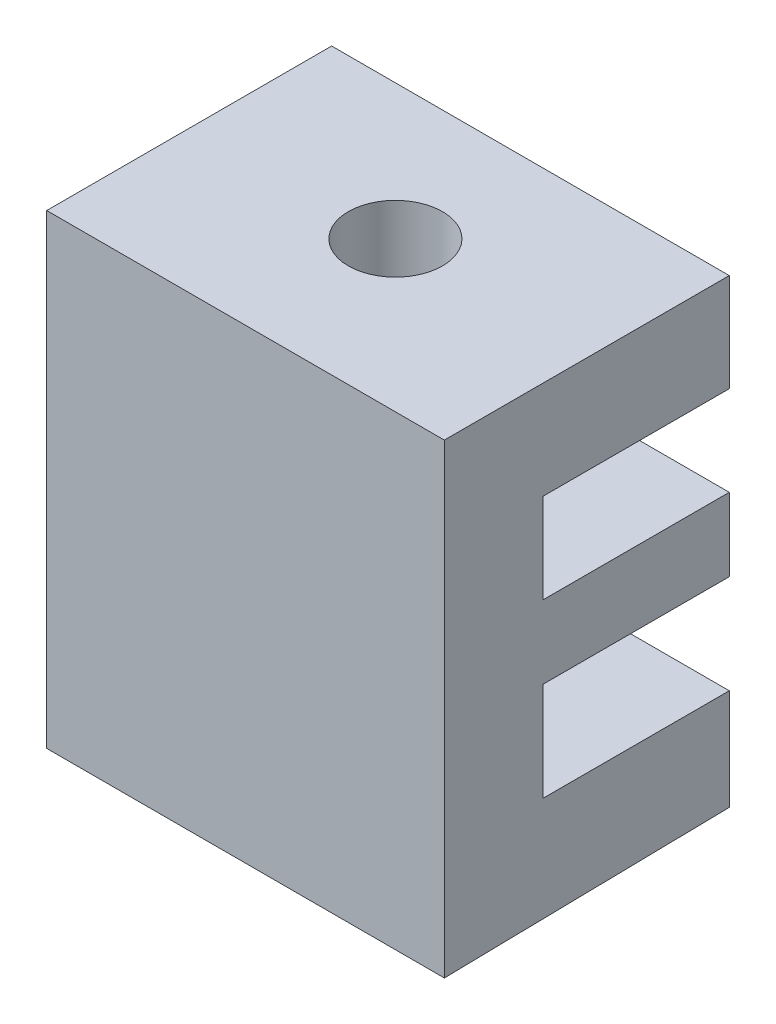
ISO-10303-21;
HEADER;
FILE_DESCRIPTION(('STEP AP214'),'2;1');
FILE_NAME('part.step','',(''),(''),'','','');
FILE_SCHEMA(('AUTOMOTIVE_DESIGN { 1 0 10303 214 1 1 1 1 }'));
ENDSEC;
DATA;
#1=APPLICATION_CONTEXT('core data for automotive mechanical design processes');
#2=APPLICATION_PROTOCOL_DEFINITION('international standard','automotive_design',2000,#1);
#3=PRODUCT_CONTEXT('',#1,'mechanical');
#4=PRODUCT('Part','Part','',(#3));
#5=PRODUCT_RELATED_PRODUCT_CATEGORY('part','',(#4));
#6=PRODUCT_DEFINITION_FORMATION('','',#4);
#7=PRODUCT_DEFINITION_CONTEXT('part definition',#1,'design');
#8=PRODUCT_DEFINITION('design','',#6,#7);
#9=PRODUCT_DEFINITION_SHAPE('','',#8);
#10=(LENGTH_UNIT() NAMED_UNIT(*) SI_UNIT(.MILLI.,.METRE.));
#11=(NAMED_UNIT(*) PLANE_ANGLE_UNIT() SI_UNIT($,.RADIAN.));
#12=(NAMED_UNIT(*) SI_UNIT($,.STERADIAN.) SOLID_ANGLE_UNIT());
#13=UNCERTAINTY_MEASURE_WITH_UNIT(LENGTH_MEASURE(1.E-05),#10,'distance_accuracy_value','');
#14=(GEOMETRIC_REPRESENTATION_CONTEXT(3) GLOBAL_UNCERTAINTY_ASSIGNED_CONTEXT((#13)) GLOBAL_UNIT_ASSIGNED_CONTEXT((#10,
#11,#12)) REPRESENTATION_CONTEXT('',''));
#15=CARTESIAN_POINT('',(0.,0.,0.));
#16=DIRECTION('',(0.,0.,1.));
#17=DIRECTION('',(1.,0.,0.));
#18=AXIS2_PLACEMENT_3D('',#15,#16,#17);
#19=CARTESIAN_POINT('',(50.,53.7467128027682,0.));
#20=DIRECTION('',(0.,0.,-1.));
#21=DIRECTION('',(-1.,0.,0.));
#22=AXIS2_PLACEMENT_3D('',#19,#20,#21);
#23=PLANE('',#22);
#24=DIRECTION('',(0.,-1.,0.));
#25=VECTOR('',#24,1.);
#26=CARTESIAN_POINT('',(-50.,53.7467128027682,0.));
#27=LINE('',#26,#25);
#28=CARTESIAN_POINT('',(-50.,67.7758371322385,0.));
#29=VERTEX_POINT('',#28);
#30=CARTESIAN_POINT('',(-50.,-49.3863092949598,0.));
#31=VERTEX_POINT('',#30);
#32=EDGE_CURVE('E100',#29,#31,#27,.T.);
#33=ORIENTED_EDGE('',*,*,#32,.T.);
#34=DIRECTION('',(-1.,0.,0.));
#35=VECTOR('',#34,1.);
#36=CARTESIAN_POINT('',(50.,-49.3863092949598,0.));
#37=LINE('',#36,#35);
#38=CARTESIAN_POINT('',(50.,-49.3863092949598,0.));
#39=VERTEX_POINT('',#38);
#40=EDGE_CURVE('E13',#39,#31,#37,.T.);
#41=ORIENTED_EDGE('',*,*,#40,.F.);
#42=DIRECTION('',(0.,-1.,0.));
#43=VECTOR('',#42,1.);
#44=CARTESIAN_POINT('',(50.,67.7758371322385,0.));
#45=LINE('',#44,#43);
#46=CARTESIAN_POINT('',(50.,67.7758371322385,0.));
#47=VERTEX_POINT('',#46);
#48=EDGE_CURVE('E106',#47,#39,#45,.T.);
#49=ORIENTED_EDGE('',*,*,#48,.F.);
#50=DIRECTION('',(-1.,0.,0.));
#51=VECTOR('',#50,1.);
#52=CARTESIAN_POINT('',(50.,67.7758371322385,0.));
#53=LINE('',#52,#51);
#54=EDGE_CURVE('E152',#47,#29,#53,.T.);
#55=ORIENTED_EDGE('',*,*,#54,.T.);
#56=EDGE_LOOP('',(#33,#41,#49,#55));
#57=FACE_BOUND('',#56,.T.);
#58=ADVANCED_FACE('F36',(#57),#23,.F.);
#59=CARTESIAN_POINT('',(50.,-49.3863092949598,0.));
#60=DIRECTION('',(0.,0.999828576325131,0.0185153440060208));
#61=DIRECTION('',(0.,-0.0185153440060208,0.999828576325131));
#62=AXIS2_PLACEMENT_3D('',#59,#60,#61);
#63=PLANE('',#62);
#64=DIRECTION('',(0.,0.0185153440060208,-0.999828576325131));
#65=VECTOR('',#64,1.);
#66=CARTESIAN_POINT('',(-50.,-49.3863092949598,0.));
#67=LINE('',#66,#65);
#68=CARTESIAN_POINT('',(-50.,-48.0592299664964,-71.6622837370242));
#69=VERTEX_POINT('',#68);
#70=EDGE_CURVE('E157',#31,#69,#67,.T.);
#71=ORIENTED_EDGE('',*,*,#70,.T.);
#72=DIRECTION('',(-1.,0.,0.));
#73=VECTOR('',#72,1.);
#74=CARTESIAN_POINT('',(50.,-48.0592299664964,-71.6622837370242));
#75=LINE('',#74,#73);
#76=CARTESIAN_POINT('',(50.,-48.0592299664964,-71.6622837370242));
#77=VERTEX_POINT('',#76);
#78=EDGE_CURVE('E44',#77,#69,#75,.T.);
#79=ORIENTED_EDGE('',*,*,#78,.F.);
#80=DIRECTION('',(0.,0.0185153440060208,-0.999828576325131));
#81=VECTOR('',#80,1.);
#82=CARTESIAN_POINT('',(50.,-49.3863092949598,0.));
#83=LINE('',#82,#81);
#84=EDGE_CURVE('E246',#39,#77,#83,.T.);
#85=ORIENTED_EDGE('',*,*,#84,.F.);
#86=ORIENTED_EDGE('',*,*,#40,.T.);
#87=EDGE_LOOP('',(#71,#79,#85,#86));
#88=FACE_BOUND('',#87,.T.);
#89=ADVANCED_FACE('F251',(#88),#63,.F.);
#90=CARTESIAN_POINT('',(50.,-48.0592299664964,-71.6622837370242));
#91=DIRECTION('',(0.,0.,1.));
#92=DIRECTION('',(1.,0.,0.));
#93=AXIS2_PLACEMENT_3D('',#90,#91,#92);
#94=PLANE('',#93);
#95=DIRECTION('',(0.,1.,0.));
#96=VECTOR('',#95,1.);
#97=CARTESIAN_POINT('',(-50.,-48.0592299664964,-71.6622837370242));
#98=LINE('',#97,#96);
#99=CARTESIAN_POINT('',(-50.,-22.6551399644825,-71.6622837370242));
#100=VERTEX_POINT('',#99);
#101=EDGE_CURVE('E160',#69,#100,#98,.T.);
#102=ORIENTED_EDGE('',*,*,#101,.T.);
#103=DIRECTION('',(-1.,0.,0.));
#104=VECTOR('',#103,1.);
#105=CARTESIAN_POINT('',(50.,-22.6551399644825,-71.6622837370242));
#106=LINE('',#105,#104);
#107=CARTESIAN_POINT('',(50.,-22.6551399644825,-71.6622837370242));
#108=VERTEX_POINT('',#107);
#109=EDGE_CURVE('E197',#108,#100,#106,.T.);
#110=ORIENTED_EDGE('',*,*,#109,.F.);
#111=DIRECTION('',(0.,1.,0.));
#112=VECTOR('',#111,1.);
#113=CARTESIAN_POINT('',(50.,-48.0592299664964,-71.6622837370242));
#114=LINE('',#113,#112);
#115=EDGE_CURVE('E206',#77,#108,#114,.T.);
#116=ORIENTED_EDGE('',*,*,#115,.F.);
#117=ORIENTED_EDGE('',*,*,#78,.T.);
#118=EDGE_LOOP('',(#102,#110,#116,#117));
#119=FACE_BOUND('',#118,.T.);
#120=ADVANCED_FACE('F204',(#119),#94,.F.);
#121=CARTESIAN_POINT('',(50.,-22.6551399644825,-71.6622837370242));
#122=DIRECTION('',(0.,-1.,0.));
#123=DIRECTION('',(0.,0.,-1.));
#124=AXIS2_PLACEMENT_3D('',#121,#122,#123);
#125=PLANE('',#124);
#126=CARTESIAN_POINT('',(0.,-22.6551399644825,-37.6952267775801));
#127=DIRECTION('',(0.,-1.,0.));
#128=DIRECTION('',(0.,0.,-1.));
#129=AXIS2_PLACEMENT_3D('',#126,#127,#128);
#130=CIRCLE('',#129,11.8384892300802);
#131=CARTESIAN_POINT('',(0.,-22.6551399644825,-49.5337160076603));
#132=VERTEX_POINT('',#131);
#133=EDGE_CURVE('E158',#132,#132,#130,.T.);
#134=ORIENTED_EDGE('',*,*,#133,.T.);
#135=EDGE_LOOP('',(#134));
#136=FACE_BOUND('',#135,.T.);
#137=DIRECTION('',(0.,0.,1.));
#138=VECTOR('',#137,1.);
#139=CARTESIAN_POINT('',(-50.,-22.6551399644825,-71.6622837370242));
#140=LINE('',#139,#138);
#141=CARTESIAN_POINT('',(-50.,-22.6551399644825,-24.8353417183867));
#142=VERTEX_POINT('',#141);
#143=EDGE_CURVE('E162',#100,#142,#140,.T.);
#144=ORIENTED_EDGE('',*,*,#143,.T.);
#145=DIRECTION('',(-1.,0.,0.));
#146=VECTOR('',#145,1.);
#147=CARTESIAN_POINT('',(50.,-22.6551399644825,-24.8353417183867));
#148=LINE('',#147,#146);
#149=CARTESIAN_POINT('',(50.,-22.6551399644825,-24.8353417183867));
#150=VERTEX_POINT('',#149);
#151=EDGE_CURVE('E194',#150,#142,#148,.T.);
#152=ORIENTED_EDGE('',*,*,#151,.F.);
#153=DIRECTION('',(0.,0.,1.));
#154=VECTOR('',#153,1.);
#155=CARTESIAN_POINT('',(50.,-22.6551399644825,-71.6622837370242));
#156=LINE('',#155,#154);
#157=EDGE_CURVE('E224',#108,#150,#156,.T.);
#158=ORIENTED_EDGE('',*,*,#157,.F.);
#159=ORIENTED_EDGE('',*,*,#109,.T.);
#160=EDGE_LOOP('',(#144,#152,#158,#159));
#161=FACE_BOUND('',#160,.T.);
#162=ADVANCED_FACE('F215',(#136,#161),#125,.F.);
#163=CARTESIAN_POINT('',(50.,-22.6551399644825,-24.8353417183867));
#164=DIRECTION('',(0.,0.,1.));
#165=DIRECTION('',(1.,0.,0.));
#166=AXIS2_PLACEMENT_3D('',#163,#164,#165);
#167=PLANE('',#166);
#168=DIRECTION('',(0.,1.,0.));
#169=VECTOR('',#168,1.);
#170=CARTESIAN_POINT('',(-50.,-22.6551399644825,-24.8353417183867));
#171=LINE('',#170,#169);
#172=CARTESIAN_POINT('',(-50.,2.18020175390417,-24.8353417183867));
#173=VERTEX_POINT('',#172);
#174=EDGE_CURVE('E164',#142,#173,#171,.T.);
#175=ORIENTED_EDGE('',*,*,#174,.T.);
#176=DIRECTION('',(-1.,0.,0.));
#177=VECTOR('',#176,1.);
#178=CARTESIAN_POINT('',(50.,2.18020175390417,-24.8353417183867));
#179=LINE('',#178,#177);
#180=CARTESIAN_POINT('',(50.,2.18020175390417,-24.8353417183867));
#181=VERTEX_POINT('',#180);
#182=EDGE_CURVE('E191',#181,#173,#179,.T.);
#183=ORIENTED_EDGE('',*,*,#182,.F.);
#184=DIRECTION('',(0.,1.,0.));
#185=VECTOR('',#184,1.);
#186=CARTESIAN_POINT('',(50.,-22.6551399644825,-24.8353417183867));
#187=LINE('',#186,#185);
#188=EDGE_CURVE('E221',#150,#181,#187,.T.);
#189=ORIENTED_EDGE('',*,*,#188,.F.);
#190=ORIENTED_EDGE('',*,*,#151,.T.);
#191=EDGE_LOOP('',(#175,#183,#189,#190));
#192=FACE_BOUND('',#191,.T.);
#193=ADVANCED_FACE('F219',(#192),#167,.F.);
#194=CARTESIAN_POINT('',(50.,2.18020175390417,-24.8353417183867));
#195=DIRECTION('',(0.,1.,0.));
#196=DIRECTION('',(0.,0.,1.));
#197=AXIS2_PLACEMENT_3D('',#194,#195,#196);
#198=PLANE('',#197);
#199=CARTESIAN_POINT('',(0.,2.18020175390417,-37.6952267775801));
#200=DIRECTION('',(0.,1.,0.));
#201=DIRECTION('',(0.,0.,1.));
#202=AXIS2_PLACEMENT_3D('',#199,#200,#201);
#203=CIRCLE('',#202,11.8384892300802);
#204=CARTESIAN_POINT('',(0.,2.18020175390417,-25.8567375474999));
#205=VERTEX_POINT('',#204);
#206=EDGE_CURVE('E319',#205,#205,#203,.T.);
#207=ORIENTED_EDGE('',*,*,#206,.T.);
#208=EDGE_LOOP('',(#207));
#209=FACE_BOUND('',#208,.T.);
#210=DIRECTION('',(0.,0.,-1.));
#211=VECTOR('',#210,1.);
#212=CARTESIAN_POINT('',(-50.,2.18020175390417,-24.8353417183867));
#213=LINE('',#212,#211);
#214=CARTESIAN_POINT('',(-50.,2.18020175390417,-71.6622837370242));
#215=VERTEX_POINT('',#214);
#216=EDGE_CURVE('E166',#173,#215,#213,.T.);
#217=ORIENTED_EDGE('',*,*,#216,.T.);
#218=DIRECTION('',(-1.,0.,0.));
#219=VECTOR('',#218,1.);
#220=CARTESIAN_POINT('',(50.,2.18020175390417,-71.6622837370242));
#221=LINE('',#220,#219);
#222=CARTESIAN_POINT('',(50.,2.18020175390417,-71.6622837370242));
#223=VERTEX_POINT('',#222);
#224=EDGE_CURVE('E188',#223,#215,#221,.T.);
#225=ORIENTED_EDGE('',*,*,#224,.F.);
#226=DIRECTION('',(0.,0.,-1.));
#227=VECTOR('',#226,1.);
#228=CARTESIAN_POINT('',(50.,2.18020175390417,-24.8353417183867));
#229=LINE('',#228,#227);
#230=EDGE_CURVE('E223',#181,#223,#229,.T.);
#231=ORIENTED_EDGE('',*,*,#230,.F.);
#232=ORIENTED_EDGE('',*,*,#182,.T.);
#233=EDGE_LOOP('',(#217,#225,#231,#232));
#234=FACE_BOUND('',#233,.T.);
#235=ADVANCED_FACE('F264',(#209,#234),#198,.F.);
#236=CARTESIAN_POINT('',(50.,2.18020175390417,-71.6622837370242));
#237=DIRECTION('',(0.,0.,1.));
#238=DIRECTION('',(1.,0.,0.));
#239=AXIS2_PLACEMENT_3D('',#236,#237,#238);
#240=PLANE('',#239);
#241=DIRECTION('',(0.,1.,0.));
#242=VECTOR('',#241,1.);
#243=CARTESIAN_POINT('',(-50.,2.18020175390417,-71.6622837370242));
#244=LINE('',#243,#242);
#245=CARTESIAN_POINT('',(-50.,20.5697295911829,-71.6622837370242));
#246=VERTEX_POINT('',#245);
#247=EDGE_CURVE('E168',#215,#246,#244,.T.);
#248=ORIENTED_EDGE('',*,*,#247,.T.);
#249=DIRECTION('',(-1.,0.,0.));
#250=VECTOR('',#249,1.);
#251=CARTESIAN_POINT('',(50.,20.5697295911829,-71.6622837370242));
#252=LINE('',#251,#250);
#253=CARTESIAN_POINT('',(50.,20.5697295911829,-71.6622837370242));
#254=VERTEX_POINT('',#253);
#255=EDGE_CURVE('E185',#254,#246,#252,.T.);
#256=ORIENTED_EDGE('',*,*,#255,.F.);
#257=DIRECTION('',(0.,1.,0.));
#258=VECTOR('',#257,1.);
#259=CARTESIAN_POINT('',(50.,2.18020175390417,-71.6622837370242));
#260=LINE('',#259,#258);
#261=EDGE_CURVE('E226',#223,#254,#260,.T.);
#262=ORIENTED_EDGE('',*,*,#261,.F.);
#263=ORIENTED_EDGE('',*,*,#224,.T.);
#264=EDGE_LOOP('',(#248,#256,#262,#263));
#265=FACE_BOUND('',#264,.T.);
#266=ADVANCED_FACE('F267',(#265),#240,.F.);
#267=CARTESIAN_POINT('',(50.,20.5697295911829,-71.6622837370242));
#268=DIRECTION('',(0.,-1.,0.));
#269=DIRECTION('',(0.,0.,-1.));
#270=AXIS2_PLACEMENT_3D('',#267,#268,#269);
#271=PLANE('',#270);
#272=CARTESIAN_POINT('',(0.,20.5697295911829,-37.6952267775801));
#273=DIRECTION('',(0.,-1.,0.));
#274=DIRECTION('',(0.,0.,-1.));
#275=AXIS2_PLACEMENT_3D('',#272,#273,#274);
#276=CIRCLE('',#275,11.8384892300802);
#277=CARTESIAN_POINT('',(0.,20.5697295911829,-49.5337160076603));
#278=VERTEX_POINT('',#277);
#279=EDGE_CURVE('E315',#278,#278,#276,.T.);
#280=ORIENTED_EDGE('',*,*,#279,.T.);
#281=EDGE_LOOP('',(#280));
#282=FACE_BOUND('',#281,.T.);
#283=DIRECTION('',(0.,0.,1.));
#284=VECTOR('',#283,1.);
#285=CARTESIAN_POINT('',(-50.,20.5697295911829,-71.6622837370242));
#286=LINE('',#285,#284);
#287=CARTESIAN_POINT('',(-50.,20.5697295911829,-24.8353417183867));
#288=VERTEX_POINT('',#287);
#289=EDGE_CURVE('E170',#246,#288,#286,.T.);
#290=ORIENTED_EDGE('',*,*,#289,.T.);
#291=DIRECTION('',(-1.,0.,0.));
#292=VECTOR('',#291,1.);
#293=CARTESIAN_POINT('',(50.,20.5697295911829,-24.8353417183867));
#294=LINE('',#293,#292);
#295=CARTESIAN_POINT('',(50.,20.5697295911829,-24.8353417183867));
#296=VERTEX_POINT('',#295);
#297=EDGE_CURVE('E182',#296,#288,#294,.T.);
#298=ORIENTED_EDGE('',*,*,#297,.F.);
#299=DIRECTION('',(0.,0.,1.));
#300=VECTOR('',#299,1.);
#301=CARTESIAN_POINT('',(50.,20.5697295911829,-71.6622837370242));
#302=LINE('',#301,#300);
#303=EDGE_CURVE('E232',#254,#296,#302,.T.);
#304=ORIENTED_EDGE('',*,*,#303,.F.);
#305=ORIENTED_EDGE('',*,*,#255,.T.);
#306=EDGE_LOOP('',(#290,#298,#304,#305));
#307=FACE_BOUND('',#306,.T.);
#308=ADVANCED_FACE('F238',(#282,#307),#271,.F.);
#309=CARTESIAN_POINT('',(50.,20.5697295911829,-24.8353417183867));
#310=DIRECTION('',(0.,0.,1.));
#311=DIRECTION('',(1.,0.,0.));
#312=AXIS2_PLACEMENT_3D('',#309,#310,#311);
#313=PLANE('',#312);
#314=DIRECTION('',(0.,1.,0.));
#315=VECTOR('',#314,1.);
#316=CARTESIAN_POINT('',(-50.,20.5697295911829,-24.8353417183867));
#317=LINE('',#316,#315);
#318=CARTESIAN_POINT('',(-50.,43.1300781750609,-24.8353417183867));
#319=VERTEX_POINT('',#318);
#320=EDGE_CURVE('E172',#288,#319,#317,.T.);
#321=ORIENTED_EDGE('',*,*,#320,.T.);
#322=DIRECTION('',(-1.,0.,0.));
#323=VECTOR('',#322,1.);
#324=CARTESIAN_POINT('',(50.,43.1300781750609,-24.8353417183867));
#325=LINE('',#324,#323);
#326=CARTESIAN_POINT('',(50.,43.1300781750609,-24.8353417183867));
#327=VERTEX_POINT('',#326);
#328=EDGE_CURVE('E147',#327,#319,#325,.T.);
#329=ORIENTED_EDGE('',*,*,#328,.F.);
#330=DIRECTION('',(0.,1.,0.));
#331=VECTOR('',#330,1.);
#332=CARTESIAN_POINT('',(50.,20.5697295911829,-24.8353417183867));
#333=LINE('',#332,#331);
#334=EDGE_CURVE('E138',#296,#327,#333,.T.);
#335=ORIENTED_EDGE('',*,*,#334,.F.);
#336=ORIENTED_EDGE('',*,*,#297,.T.);
#337=EDGE_LOOP('',(#321,#329,#335,#336));
#338=FACE_BOUND('',#337,.T.);
#339=ADVANCED_FACE('F242',(#338),#313,.F.);
#340=CARTESIAN_POINT('',(50.,43.1300781750609,-24.8353417183867));
#341=DIRECTION('',(0.,1.,0.));
#342=DIRECTION('',(0.,0.,1.));
#343=AXIS2_PLACEMENT_3D('',#340,#341,#342);
#344=PLANE('',#343);
#345=CARTESIAN_POINT('',(0.,43.1300781750609,-37.6952267775801));
#346=DIRECTION('',(0.,1.,0.));
#347=DIRECTION('',(0.,0.,1.));
#348=AXIS2_PLACEMENT_3D('',#345,#346,#347);
#349=CIRCLE('',#348,11.8384892300802);
#350=CARTESIAN_POINT('',(0.,43.1300781750609,-25.8567375474999));
#351=VERTEX_POINT('',#350);
#352=EDGE_CURVE('E314',#351,#351,#349,.T.);
#353=ORIENTED_EDGE('',*,*,#352,.T.);
#354=EDGE_LOOP('',(#353));
#355=FACE_BOUND('',#354,.T.);
#356=DIRECTION('',(0.,0.,-1.));
#357=VECTOR('',#356,1.);
#358=CARTESIAN_POINT('',(-50.,43.1300781750609,-24.8353417183867));
#359=LINE('',#358,#357);
#360=CARTESIAN_POINT('',(-50.,43.1300781750609,-71.6622837370242));
#361=VERTEX_POINT('',#360);
#362=EDGE_CURVE('E146',#319,#361,#359,.T.);
#363=ORIENTED_EDGE('',*,*,#362,.T.);
#364=DIRECTION('',(-1.,0.,0.));
#365=VECTOR('',#364,1.);
#366=CARTESIAN_POINT('',(50.,43.1300781750609,-71.6622837370242));
#367=LINE('',#366,#365);
#368=CARTESIAN_POINT('',(50.,43.1300781750609,-71.6622837370242));
#369=VERTEX_POINT('',#368);
#370=EDGE_CURVE('E143',#369,#361,#367,.T.);
#371=ORIENTED_EDGE('',*,*,#370,.F.);
#372=DIRECTION('',(0.,0.,-1.));
#373=VECTOR('',#372,1.);
#374=CARTESIAN_POINT('',(50.,43.1300781750609,-24.8353417183867));
#375=LINE('',#374,#373);
#376=EDGE_CURVE('E132',#327,#369,#375,.T.);
#377=ORIENTED_EDGE('',*,*,#376,.F.);
#378=ORIENTED_EDGE('',*,*,#328,.T.);
#379=EDGE_LOOP('',(#363,#371,#377,#378));
#380=FACE_BOUND('',#379,.T.);
#381=ADVANCED_FACE('F144',(#355,#380),#344,.F.);
#382=CARTESIAN_POINT('',(50.,43.1300781750609,-71.6622837370242));
#383=DIRECTION('',(0.,0.,1.));
#384=DIRECTION('',(1.,0.,0.));
#385=AXIS2_PLACEMENT_3D('',#382,#383,#384);
#386=PLANE('',#385);
#387=DIRECTION('',(0.,1.,0.));
#388=VECTOR('',#387,1.);
#389=CARTESIAN_POINT('',(-50.,43.1300781750609,-71.6622837370242));
#390=LINE('',#389,#388);
#391=CARTESIAN_POINT('',(-50.,67.7758371322385,-71.6622837370242));
#392=VERTEX_POINT('',#391);
#393=EDGE_CURVE('E93',#361,#392,#390,.T.);
#394=ORIENTED_EDGE('',*,*,#393,.T.);
#395=DIRECTION('',(-1.,0.,0.));
#396=VECTOR('',#395,1.);
#397=CARTESIAN_POINT('',(50.,67.7758371322385,-71.6622837370242));
#398=LINE('',#397,#396);
#399=CARTESIAN_POINT('',(50.,67.7758371322385,-71.6622837370242));
#400=VERTEX_POINT('',#399);
#401=EDGE_CURVE('E148',#400,#392,#398,.T.);
#402=ORIENTED_EDGE('',*,*,#401,.F.);
#403=DIRECTION('',(0.,1.,0.));
#404=VECTOR('',#403,1.);
#405=CARTESIAN_POINT('',(50.,43.1300781750609,-71.6622837370242));
#406=LINE('',#405,#404);
#407=EDGE_CURVE('E136',#369,#400,#406,.T.);
#408=ORIENTED_EDGE('',*,*,#407,.F.);
#409=ORIENTED_EDGE('',*,*,#370,.T.);
#410=EDGE_LOOP('',(#394,#402,#408,#409));
#411=FACE_BOUND('',#410,.T.);
#412=ADVANCED_FACE('F150',(#411),#386,.F.);
#413=CARTESIAN_POINT('',(50.,67.7758371322385,-71.6622837370242));
#414=DIRECTION('',(0.,-1.,0.));
#415=DIRECTION('',(0.,0.,-1.));
#416=AXIS2_PLACEMENT_3D('',#413,#414,#415);
#417=PLANE('',#416);
#418=CARTESIAN_POINT('',(0.,67.7758371322385,-37.6952267775801));
#419=DIRECTION('',(0.,1.,0.));
#420=DIRECTION('',(0.,0.,1.));
#421=AXIS2_PLACEMENT_3D('',#418,#419,#420);
#422=CIRCLE('',#421,11.8384892300802);
#423=CARTESIAN_POINT('',(0.,67.7758371322385,-25.8567375474999));
#424=VERTEX_POINT('',#423);
#425=EDGE_CURVE('E311',#424,#424,#422,.T.);
#426=ORIENTED_EDGE('',*,*,#425,.F.);
#427=EDGE_LOOP('',(#426));
#428=FACE_BOUND('',#427,.T.);
#429=DIRECTION('',(0.,0.,1.));
#430=VECTOR('',#429,1.);
#431=CARTESIAN_POINT('',(-50.,67.7758371322385,-71.6622837370242));
#432=LINE('',#431,#430);
#433=EDGE_CURVE('E176',#392,#29,#432,.T.);
#434=ORIENTED_EDGE('',*,*,#433,.T.);
#435=ORIENTED_EDGE('',*,*,#54,.F.);
#436=DIRECTION('',(0.,0.,1.));
#437=VECTOR('',#436,1.);
#438=CARTESIAN_POINT('',(50.,67.7758371322385,-71.6622837370242));
#439=LINE('',#438,#437);
#440=EDGE_CURVE('E52',#400,#47,#439,.T.);
#441=ORIENTED_EDGE('',*,*,#440,.F.);
#442=ORIENTED_EDGE('',*,*,#401,.T.);
#443=EDGE_LOOP('',(#434,#435,#441,#442));
#444=FACE_BOUND('',#443,.T.);
#445=ADVANCED_FACE('F244',(#428,#444),#417,.F.);
#446=CARTESIAN_POINT('',(50.,0.,0.));
#447=DIRECTION('',(-1.,0.,0.));
#448=DIRECTION('',(0.,0.,1.));
#449=AXIS2_PLACEMENT_3D('',#446,#447,#448);
#450=PLANE('',#449);
#451=ORIENTED_EDGE('',*,*,#48,.T.);
#452=ORIENTED_EDGE('',*,*,#84,.T.);
#453=ORIENTED_EDGE('',*,*,#115,.T.);
#454=ORIENTED_EDGE('',*,*,#157,.T.);
#455=ORIENTED_EDGE('',*,*,#188,.T.);
#456=ORIENTED_EDGE('',*,*,#230,.T.);
#457=ORIENTED_EDGE('',*,*,#261,.T.);
#458=ORIENTED_EDGE('',*,*,#303,.T.);
#459=ORIENTED_EDGE('',*,*,#334,.T.);
#460=ORIENTED_EDGE('',*,*,#376,.T.);
#461=ORIENTED_EDGE('',*,*,#407,.T.);
#462=ORIENTED_EDGE('',*,*,#440,.T.);
#463=EDGE_LOOP('',(#451,#452,#453,#454,#455,#456,#457,#458,#459,#460,#461,#462));
#464=FACE_BOUND('',#463,.T.);
#465=ADVANCED_FACE('F134',(#464),#450,.F.);
#466=CARTESIAN_POINT('',(-50.,0.,0.));
#467=DIRECTION('',(-1.,0.,0.));
#468=DIRECTION('',(0.,0.,1.));
#469=AXIS2_PLACEMENT_3D('',#466,#467,#468);
#470=PLANE('',#469);
#471=ORIENTED_EDGE('',*,*,#32,.F.);
#472=ORIENTED_EDGE('',*,*,#433,.F.);
#473=ORIENTED_EDGE('',*,*,#393,.F.);
#474=ORIENTED_EDGE('',*,*,#362,.F.);
#475=ORIENTED_EDGE('',*,*,#320,.F.);
#476=ORIENTED_EDGE('',*,*,#289,.F.);
#477=ORIENTED_EDGE('',*,*,#247,.F.);
#478=ORIENTED_EDGE('',*,*,#216,.F.);
#479=ORIENTED_EDGE('',*,*,#174,.F.);
#480=ORIENTED_EDGE('',*,*,#143,.F.);
#481=ORIENTED_EDGE('',*,*,#101,.F.);
#482=ORIENTED_EDGE('',*,*,#70,.F.);
#483=EDGE_LOOP('',(#471,#472,#473,#474,#475,#476,#477,#478,#479,#480,#481,#482));
#484=FACE_BOUND('',#483,.T.);
#485=ADVANCED_FACE('F210',(#484),#470,.T.);
#486=CARTESIAN_POINT('',(0.,-76.139444018857,-37.6952267775801));
#487=DIRECTION('',(0.,1.,0.));
#488=DIRECTION('',(0.,0.,1.));
#489=AXIS2_PLACEMENT_3D('',#486,#487,#488);
#490=CYLINDRICAL_SURFACE('',#489,11.8384892300802);
#491=ORIENTED_EDGE('',*,*,#425,.T.);
#492=EDGE_LOOP('',(#491));
#493=FACE_BOUND('',#492,.T.);
#494=ORIENTED_EDGE('',*,*,#352,.F.);
#495=EDGE_LOOP('',(#494));
#496=FACE_BOUND('',#495,.T.);
#497=ADVANCED_FACE('F287',(#493,#496),#490,.F.);
#498=ORIENTED_EDGE('',*,*,#279,.F.);
#499=EDGE_LOOP('',(#498));
#500=FACE_BOUND('',#499,.T.);
#501=ORIENTED_EDGE('',*,*,#206,.F.);
#502=EDGE_LOOP('',(#501));
#503=FACE_BOUND('',#502,.T.);
#504=ADVANCED_FACE('F296',(#500,#503),#490,.F.);
#505=CARTESIAN_POINT('',(0.,-32.6551399644825,-37.6952267775801));
#506=DIRECTION('',(0.,-1.,0.));
#507=DIRECTION('',(0.,0.,-1.));
#508=AXIS2_PLACEMENT_3D('',#505,#506,#507);
#509=CIRCLE('',#508,11.8384892300802);
#510=CARTESIAN_POINT('',(0.,-32.6551399644825,-49.5337160076603));
#511=VERTEX_POINT('',#510);
#512=EDGE_CURVE('E316',#511,#511,#509,.F.);
#513=ORIENTED_EDGE('',*,*,#512,.F.);
#514=EDGE_LOOP('',(#513));
#515=FACE_BOUND('',#514,.T.);
#516=ORIENTED_EDGE('',*,*,#133,.F.);
#517=EDGE_LOOP('',(#516));
#518=FACE_BOUND('',#517,.T.);
#519=ADVANCED_FACE('F293',(#515,#518),#490,.F.);
#520=CARTESIAN_POINT('',(50.,-32.6551399644825,-71.6622837370242));
#521=DIRECTION('',(0.,-1.,0.));
#522=DIRECTION('',(0.,0.,-1.));
#523=AXIS2_PLACEMENT_3D('',#520,#521,#522);
#524=PLANE('',#523);
#525=ORIENTED_EDGE('',*,*,#512,.T.);
#526=EDGE_LOOP('',(#525));
#527=FACE_BOUND('',#526,.T.);
#528=ADVANCED_FACE('F290',(#527),#524,.F.);
#529=CLOSED_SHELL('',(#58,#89,#120,#162,#193,#235,#266,#308,#339,#381,#412,#445,#465,#485,#497,
#504,#519,#528));
#530=MANIFOLD_SOLID_BREP('B2',#529);
#531=ADVANCED_BREP_SHAPE_REPRESENTATION('',(#18,#530),#14);
#532=SHAPE_DEFINITION_REPRESENTATION(#9,#531);
ENDSEC;
END-ISO-10303-21;
